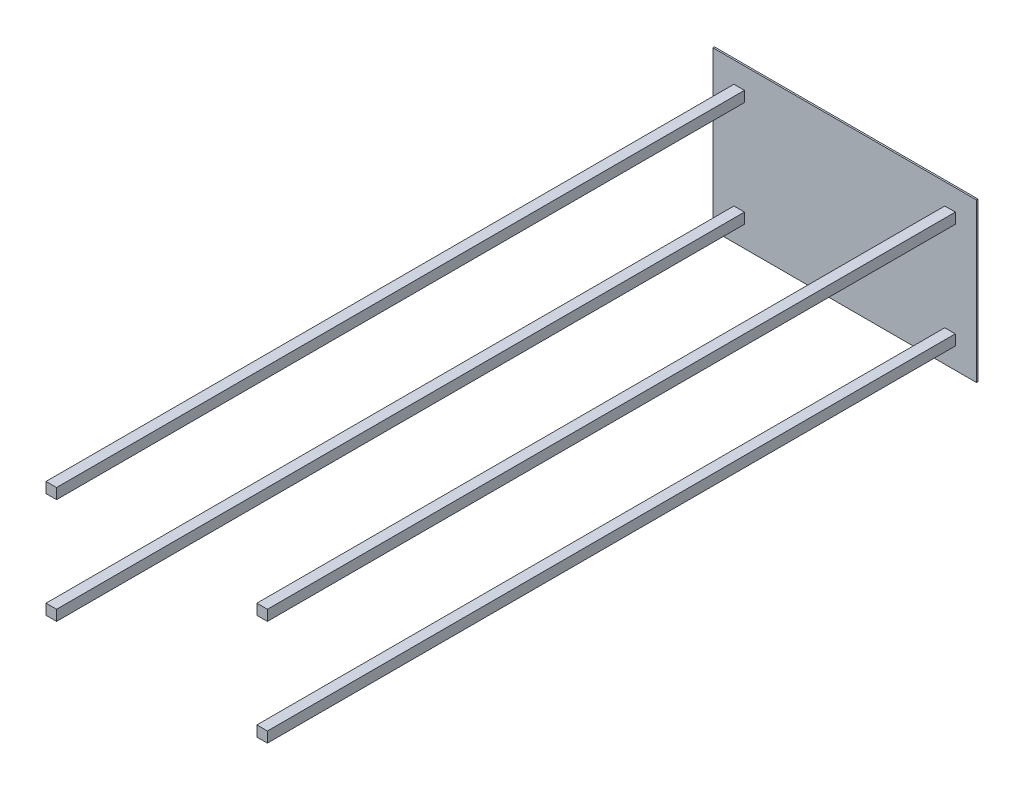
ISO-10303-21;
HEADER;
FILE_DESCRIPTION(('STEP AP214'),'2;1');
FILE_NAME('part.step','',(''),(''),'','','');
FILE_SCHEMA(('AUTOMOTIVE_DESIGN { 1 0 10303 214 1 1 1 1 }'));
ENDSEC;
DATA;
#1=APPLICATION_CONTEXT('core data for automotive mechanical design processes');
#2=APPLICATION_PROTOCOL_DEFINITION('international standard','automotive_design',2000,#1);
#3=PRODUCT_CONTEXT('',#1,'mechanical');
#4=PRODUCT('Part','Part','',(#3));
#5=PRODUCT_RELATED_PRODUCT_CATEGORY('part','',(#4));
#6=PRODUCT_DEFINITION_FORMATION('','',#4);
#7=PRODUCT_DEFINITION_CONTEXT('part definition',#1,'design');
#8=PRODUCT_DEFINITION('design','',#6,#7);
#9=PRODUCT_DEFINITION_SHAPE('','',#8);
#10=(LENGTH_UNIT() NAMED_UNIT(*) SI_UNIT(.MILLI.,.METRE.));
#11=(NAMED_UNIT(*) PLANE_ANGLE_UNIT() SI_UNIT($,.RADIAN.));
#12=(NAMED_UNIT(*) SI_UNIT($,.STERADIAN.) SOLID_ANGLE_UNIT());
#13=UNCERTAINTY_MEASURE_WITH_UNIT(LENGTH_MEASURE(1.E-05),#10,'distance_accuracy_value','');
#14=(GEOMETRIC_REPRESENTATION_CONTEXT(3) GLOBAL_UNCERTAINTY_ASSIGNED_CONTEXT((#13)) GLOBAL_UNIT_ASSIGNED_CONTEXT((#10,
#11,#12)) REPRESENTATION_CONTEXT('',''));
#15=CARTESIAN_POINT('',(0.,0.,0.));
#16=DIRECTION('',(0.,0.,1.));
#17=DIRECTION('',(1.,0.,0.));
#18=AXIS2_PLACEMENT_3D('',#15,#16,#17);
#19=CARTESIAN_POINT('',(0.,0.,3.));
#20=DIRECTION('',(0.,0.,-1.));
#21=DIRECTION('',(-1.,0.,0.));
#22=AXIS2_PLACEMENT_3D('',#19,#20,#21);
#23=PLANE('',#22);
#24=DIRECTION('',(0.,1.,0.));
#25=VECTOR('',#24,1.);
#26=CARTESIAN_POINT('',(-190.,-110.,3.));
#27=LINE('',#26,#25);
#28=CARTESIAN_POINT('',(-190.,-110.,3.));
#29=VERTEX_POINT('',#28);
#30=CARTESIAN_POINT('',(-190.,-90.,3.));
#31=VERTEX_POINT('',#30);
#32=EDGE_CURVE('E205',#29,#31,#27,.T.);
#33=ORIENTED_EDGE('',*,*,#32,.F.);
#34=DIRECTION('',(1.,0.,0.));
#35=VECTOR('',#34,1.);
#36=CARTESIAN_POINT('',(-210.,-110.,3.));
#37=LINE('',#36,#35);
#38=CARTESIAN_POINT('',(-210.,-110.,3.));
#39=VERTEX_POINT('',#38);
#40=EDGE_CURVE('E223',#39,#29,#37,.T.);
#41=ORIENTED_EDGE('',*,*,#40,.F.);
#42=DIRECTION('',(0.,-1.,0.));
#43=VECTOR('',#42,1.);
#44=CARTESIAN_POINT('',(-210.,-110.,3.));
#45=LINE('',#44,#43);
#46=CARTESIAN_POINT('',(-210.,-90.,3.));
#47=VERTEX_POINT('',#46);
#48=EDGE_CURVE('E236',#47,#39,#45,.T.);
#49=ORIENTED_EDGE('',*,*,#48,.F.);
#50=DIRECTION('',(-1.,0.,0.));
#51=VECTOR('',#50,1.);
#52=CARTESIAN_POINT('',(-210.,-90.,3.));
#53=LINE('',#52,#51);
#54=EDGE_CURVE('E211',#31,#47,#53,.T.);
#55=ORIENTED_EDGE('',*,*,#54,.F.);
#56=EDGE_LOOP('',(#33,#41,#49,#55));
#57=FACE_BOUND('',#56,.T.);
#58=DIRECTION('',(0.,1.,0.));
#59=VECTOR('',#58,1.);
#60=CARTESIAN_POINT('',(-190.,90.,3.));
#61=LINE('',#60,#59);
#62=CARTESIAN_POINT('',(-190.,90.,3.));
#63=VERTEX_POINT('',#62);
#64=CARTESIAN_POINT('',(-190.,110.,3.));
#65=VERTEX_POINT('',#64);
#66=EDGE_CURVE('E302',#63,#65,#61,.T.);
#67=ORIENTED_EDGE('',*,*,#66,.F.);
#68=DIRECTION('',(1.,0.,0.));
#69=VECTOR('',#68,1.);
#70=CARTESIAN_POINT('',(-210.,90.,3.));
#71=LINE('',#70,#69);
#72=CARTESIAN_POINT('',(-210.,90.,3.));
#73=VERTEX_POINT('',#72);
#74=EDGE_CURVE('E308',#73,#63,#71,.T.);
#75=ORIENTED_EDGE('',*,*,#74,.F.);
#76=DIRECTION('',(0.,-1.,0.));
#77=VECTOR('',#76,1.);
#78=CARTESIAN_POINT('',(-210.,90.,3.));
#79=LINE('',#78,#77);
#80=CARTESIAN_POINT('',(-210.,110.,3.));
#81=VERTEX_POINT('',#80);
#82=EDGE_CURVE('E325',#81,#73,#79,.T.);
#83=ORIENTED_EDGE('',*,*,#82,.F.);
#84=DIRECTION('',(-1.,0.,0.));
#85=VECTOR('',#84,1.);
#86=CARTESIAN_POINT('',(-210.,110.,3.));
#87=LINE('',#86,#85);
#88=EDGE_CURVE('E321',#65,#81,#87,.T.);
#89=ORIENTED_EDGE('',*,*,#88,.F.);
#90=EDGE_LOOP('',(#67,#75,#83,#89));
#91=FACE_BOUND('',#90,.T.);
#92=DIRECTION('',(0.,1.,0.));
#93=VECTOR('',#92,1.);
#94=CARTESIAN_POINT('',(250.,-150.,3.));
#95=LINE('',#94,#93);
#96=CARTESIAN_POINT('',(250.,-150.,3.));
#97=VERTEX_POINT('',#96);
#98=CARTESIAN_POINT('',(250.,150.,3.));
#99=VERTEX_POINT('',#98);
#100=EDGE_CURVE('E348',#97,#99,#95,.T.);
#101=ORIENTED_EDGE('',*,*,#100,.T.);
#102=DIRECTION('',(-1.,0.,0.));
#103=VECTOR('',#102,1.);
#104=CARTESIAN_POINT('',(-250.,150.,3.));
#105=LINE('',#104,#103);
#106=CARTESIAN_POINT('',(-250.,150.,3.));
#107=VERTEX_POINT('',#106);
#108=EDGE_CURVE('E352',#99,#107,#105,.T.);
#109=ORIENTED_EDGE('',*,*,#108,.T.);
#110=DIRECTION('',(0.,-1.,0.));
#111=VECTOR('',#110,1.);
#112=CARTESIAN_POINT('',(-250.,-150.,3.));
#113=LINE('',#112,#111);
#114=CARTESIAN_POINT('',(-250.,-150.,3.));
#115=VERTEX_POINT('',#114);
#116=EDGE_CURVE('E356',#107,#115,#113,.T.);
#117=ORIENTED_EDGE('',*,*,#116,.T.);
#118=DIRECTION('',(1.,0.,0.));
#119=VECTOR('',#118,1.);
#120=CARTESIAN_POINT('',(-250.,-150.,3.));
#121=LINE('',#120,#119);
#122=EDGE_CURVE('E359',#115,#97,#121,.T.);
#123=ORIENTED_EDGE('',*,*,#122,.T.);
#124=EDGE_LOOP('',(#101,#109,#117,#123));
#125=FACE_BOUND('',#124,.T.);
#126=DIRECTION('',(0.,1.,0.));
#127=VECTOR('',#126,1.);
#128=CARTESIAN_POINT('',(210.,90.,3.));
#129=LINE('',#128,#127);
#130=CARTESIAN_POINT('',(210.,90.,3.));
#131=VERTEX_POINT('',#130);
#132=CARTESIAN_POINT('',(210.,110.,3.));
#133=VERTEX_POINT('',#132);
#134=EDGE_CURVE('E258',#131,#133,#129,.T.);
#135=ORIENTED_EDGE('',*,*,#134,.F.);
#136=DIRECTION('',(1.,0.,0.));
#137=VECTOR('',#136,1.);
#138=CARTESIAN_POINT('',(190.,90.,3.));
#139=LINE('',#138,#137);
#140=CARTESIAN_POINT('',(190.,90.,3.));
#141=VERTEX_POINT('',#140);
#142=EDGE_CURVE('E264',#141,#131,#139,.T.);
#143=ORIENTED_EDGE('',*,*,#142,.F.);
#144=DIRECTION('',(0.,-1.,0.));
#145=VECTOR('',#144,1.);
#146=CARTESIAN_POINT('',(190.,90.,3.));
#147=LINE('',#146,#145);
#148=CARTESIAN_POINT('',(190.,110.,3.));
#149=VERTEX_POINT('',#148);
#150=EDGE_CURVE('E280',#149,#141,#147,.T.);
#151=ORIENTED_EDGE('',*,*,#150,.F.);
#152=DIRECTION('',(-1.,0.,0.));
#153=VECTOR('',#152,1.);
#154=CARTESIAN_POINT('',(190.,110.,3.));
#155=LINE('',#154,#153);
#156=EDGE_CURVE('E276',#133,#149,#155,.T.);
#157=ORIENTED_EDGE('',*,*,#156,.F.);
#158=EDGE_LOOP('',(#135,#143,#151,#157));
#159=FACE_BOUND('',#158,.T.);
#160=DIRECTION('',(0.,1.,0.));
#161=VECTOR('',#160,1.);
#162=CARTESIAN_POINT('',(210.,-110.,3.));
#163=LINE('',#162,#161);
#164=CARTESIAN_POINT('',(210.,-110.,3.));
#165=VERTEX_POINT('',#164);
#166=CARTESIAN_POINT('',(210.,-90.,3.));
#167=VERTEX_POINT('',#166);
#168=EDGE_CURVE('E203',#165,#167,#163,.T.);
#169=ORIENTED_EDGE('',*,*,#168,.F.);
#170=DIRECTION('',(1.,0.,0.));
#171=VECTOR('',#170,1.);
#172=CARTESIAN_POINT('',(190.,-110.,3.));
#173=LINE('',#172,#171);
#174=CARTESIAN_POINT('',(190.,-110.,3.));
#175=VERTEX_POINT('',#174);
#176=EDGE_CURVE('E200',#175,#165,#173,.T.);
#177=ORIENTED_EDGE('',*,*,#176,.F.);
#178=DIRECTION('',(0.,-1.,0.));
#179=VECTOR('',#178,1.);
#180=CARTESIAN_POINT('',(190.,-110.,3.));
#181=LINE('',#180,#179);
#182=CARTESIAN_POINT('',(190.,-90.,3.));
#183=VERTEX_POINT('',#182);
#184=EDGE_CURVE('E64',#183,#175,#181,.T.);
#185=ORIENTED_EDGE('',*,*,#184,.F.);
#186=DIRECTION('',(-1.,0.,0.));
#187=VECTOR('',#186,1.);
#188=CARTESIAN_POINT('',(190.,-90.,3.));
#189=LINE('',#188,#187);
#190=EDGE_CURVE('E59',#167,#183,#189,.T.);
#191=ORIENTED_EDGE('',*,*,#190,.F.);
#192=EDGE_LOOP('',(#169,#177,#185,#191));
#193=FACE_BOUND('',#192,.T.);
#194=ADVANCED_FACE('F43',(#57,#91,#125,#159,#193),#23,.F.);
#195=CARTESIAN_POINT('',(250.,-150.,3.));
#196=DIRECTION('',(-1.,0.,0.));
#197=DIRECTION('',(0.,0.,1.));
#198=AXIS2_PLACEMENT_3D('',#195,#196,#197);
#199=PLANE('',#198);
#200=DIRECTION('',(0.,1.,0.));
#201=VECTOR('',#200,1.);
#202=CARTESIAN_POINT('',(250.,-150.,0.));
#203=LINE('',#202,#201);
#204=CARTESIAN_POINT('',(250.,-150.,0.));
#205=VERTEX_POINT('',#204);
#206=CARTESIAN_POINT('',(250.,150.,0.));
#207=VERTEX_POINT('',#206);
#208=EDGE_CURVE('E347',#205,#207,#203,.T.);
#209=ORIENTED_EDGE('',*,*,#208,.T.);
#210=DIRECTION('',(0.,0.,-1.));
#211=VECTOR('',#210,1.);
#212=CARTESIAN_POINT('',(250.,150.,3.));
#213=LINE('',#212,#211);
#214=EDGE_CURVE('E11',#99,#207,#213,.T.);
#215=ORIENTED_EDGE('',*,*,#214,.F.);
#216=ORIENTED_EDGE('',*,*,#100,.F.);
#217=DIRECTION('',(0.,0.,-1.));
#218=VECTOR('',#217,1.);
#219=CARTESIAN_POINT('',(250.,-150.,3.));
#220=LINE('',#219,#218);
#221=EDGE_CURVE('E362',#97,#205,#220,.T.);
#222=ORIENTED_EDGE('',*,*,#221,.T.);
#223=EDGE_LOOP('',(#209,#215,#216,#222));
#224=FACE_BOUND('',#223,.T.);
#225=ADVANCED_FACE('F45',(#224),#199,.F.);
#226=CARTESIAN_POINT('',(-250.,150.,3.));
#227=DIRECTION('',(0.,-1.,0.));
#228=DIRECTION('',(0.,0.,-1.));
#229=AXIS2_PLACEMENT_3D('',#226,#227,#228);
#230=PLANE('',#229);
#231=DIRECTION('',(-1.,0.,0.));
#232=VECTOR('',#231,1.);
#233=CARTESIAN_POINT('',(-250.,150.,0.));
#234=LINE('',#233,#232);
#235=CARTESIAN_POINT('',(-250.,150.,0.));
#236=VERTEX_POINT('',#235);
#237=EDGE_CURVE('E366',#207,#236,#234,.T.);
#238=ORIENTED_EDGE('',*,*,#237,.T.);
#239=DIRECTION('',(0.,0.,-1.));
#240=VECTOR('',#239,1.);
#241=CARTESIAN_POINT('',(-250.,150.,3.));
#242=LINE('',#241,#240);
#243=EDGE_CURVE('E52',#107,#236,#242,.T.);
#244=ORIENTED_EDGE('',*,*,#243,.F.);
#245=ORIENTED_EDGE('',*,*,#108,.F.);
#246=ORIENTED_EDGE('',*,*,#214,.T.);
#247=EDGE_LOOP('',(#238,#244,#245,#246));
#248=FACE_BOUND('',#247,.T.);
#249=ADVANCED_FACE('F402',(#248),#230,.F.);
#250=CARTESIAN_POINT('',(-250.,-150.,3.));
#251=DIRECTION('',(1.,0.,0.));
#252=DIRECTION('',(0.,0.,-1.));
#253=AXIS2_PLACEMENT_3D('',#250,#251,#252);
#254=PLANE('',#253);
#255=DIRECTION('',(0.,-1.,0.));
#256=VECTOR('',#255,1.);
#257=CARTESIAN_POINT('',(-250.,-150.,0.));
#258=LINE('',#257,#256);
#259=CARTESIAN_POINT('',(-250.,-150.,0.));
#260=VERTEX_POINT('',#259);
#261=EDGE_CURVE('E369',#236,#260,#258,.T.);
#262=ORIENTED_EDGE('',*,*,#261,.T.);
#263=DIRECTION('',(0.,0.,-1.));
#264=VECTOR('',#263,1.);
#265=CARTESIAN_POINT('',(-250.,-150.,3.));
#266=LINE('',#265,#264);
#267=EDGE_CURVE('E377',#115,#260,#266,.T.);
#268=ORIENTED_EDGE('',*,*,#267,.F.);
#269=ORIENTED_EDGE('',*,*,#116,.F.);
#270=ORIENTED_EDGE('',*,*,#243,.T.);
#271=EDGE_LOOP('',(#262,#268,#269,#270));
#272=FACE_BOUND('',#271,.T.);
#273=ADVANCED_FACE('F386',(#272),#254,.F.);
#274=CARTESIAN_POINT('',(-250.,-150.,3.));
#275=DIRECTION('',(0.,1.,0.));
#276=DIRECTION('',(0.,0.,1.));
#277=AXIS2_PLACEMENT_3D('',#274,#275,#276);
#278=PLANE('',#277);
#279=DIRECTION('',(1.,0.,0.));
#280=VECTOR('',#279,1.);
#281=CARTESIAN_POINT('',(-250.,-150.,0.));
#282=LINE('',#281,#280);
#283=EDGE_CURVE('E353',#260,#205,#282,.T.);
#284=ORIENTED_EDGE('',*,*,#283,.T.);
#285=ORIENTED_EDGE('',*,*,#221,.F.);
#286=ORIENTED_EDGE('',*,*,#122,.F.);
#287=ORIENTED_EDGE('',*,*,#267,.T.);
#288=EDGE_LOOP('',(#284,#285,#286,#287));
#289=FACE_BOUND('',#288,.T.);
#290=ADVANCED_FACE('F395',(#289),#278,.F.);
#291=CARTESIAN_POINT('',(0.,0.,0.));
#292=DIRECTION('',(0.,0.,-1.));
#293=DIRECTION('',(-1.,0.,0.));
#294=AXIS2_PLACEMENT_3D('',#291,#292,#293);
#295=PLANE('',#294);
#296=ORIENTED_EDGE('',*,*,#208,.F.);
#297=ORIENTED_EDGE('',*,*,#283,.F.);
#298=ORIENTED_EDGE('',*,*,#261,.F.);
#299=ORIENTED_EDGE('',*,*,#237,.F.);
#300=EDGE_LOOP('',(#296,#297,#298,#299));
#301=FACE_BOUND('',#300,.T.);
#302=ADVANCED_FACE('F392',(#301),#295,.T.);
#303=CARTESIAN_POINT('',(-190.,90.,1308.));
#304=DIRECTION('',(-1.,0.,0.));
#305=DIRECTION('',(0.,0.,1.));
#306=AXIS2_PLACEMENT_3D('',#303,#304,#305);
#307=PLANE('',#306);
#308=ORIENTED_EDGE('',*,*,#66,.T.);
#309=DIRECTION('',(0.,0.,-1.));
#310=VECTOR('',#309,1.);
#311=CARTESIAN_POINT('',(-190.,110.,1308.));
#312=LINE('',#311,#310);
#313=CARTESIAN_POINT('',(-190.,110.,1308.));
#314=VERTEX_POINT('',#313);
#315=EDGE_CURVE('E343',#314,#65,#312,.T.);
#316=ORIENTED_EDGE('',*,*,#315,.F.);
#317=DIRECTION('',(0.,1.,0.));
#318=VECTOR('',#317,1.);
#319=CARTESIAN_POINT('',(-190.,90.,1308.));
#320=LINE('',#319,#318);
#321=CARTESIAN_POINT('',(-190.,90.,1308.));
#322=VERTEX_POINT('',#321);
#323=EDGE_CURVE('E303',#322,#314,#320,.T.);
#324=ORIENTED_EDGE('',*,*,#323,.F.);
#325=DIRECTION('',(0.,0.,-1.));
#326=VECTOR('',#325,1.);
#327=CARTESIAN_POINT('',(-190.,90.,1308.));
#328=LINE('',#327,#326);
#329=EDGE_CURVE('E317',#322,#63,#328,.T.);
#330=ORIENTED_EDGE('',*,*,#329,.T.);
#331=EDGE_LOOP('',(#308,#316,#324,#330));
#332=FACE_BOUND('',#331,.T.);
#333=ADVANCED_FACE('F417',(#332),#307,.F.);
#334=CARTESIAN_POINT('',(-210.,110.,1308.));
#335=DIRECTION('',(0.,-1.,0.));
#336=DIRECTION('',(0.,0.,-1.));
#337=AXIS2_PLACEMENT_3D('',#334,#335,#336);
#338=PLANE('',#337);
#339=ORIENTED_EDGE('',*,*,#88,.T.);
#340=DIRECTION('',(0.,0.,-1.));
#341=VECTOR('',#340,1.);
#342=CARTESIAN_POINT('',(-210.,110.,1308.));
#343=LINE('',#342,#341);
#344=CARTESIAN_POINT('',(-210.,110.,1308.));
#345=VERTEX_POINT('',#344);
#346=EDGE_CURVE('E339',#345,#81,#343,.T.);
#347=ORIENTED_EDGE('',*,*,#346,.F.);
#348=DIRECTION('',(-1.,0.,0.));
#349=VECTOR('',#348,1.);
#350=CARTESIAN_POINT('',(-210.,110.,1308.));
#351=LINE('',#350,#349);
#352=EDGE_CURVE('E307',#314,#345,#351,.T.);
#353=ORIENTED_EDGE('',*,*,#352,.F.);
#354=ORIENTED_EDGE('',*,*,#315,.T.);
#355=EDGE_LOOP('',(#339,#347,#353,#354));
#356=FACE_BOUND('',#355,.T.);
#357=ADVANCED_FACE('F434',(#356),#338,.F.);
#358=CARTESIAN_POINT('',(-210.,90.,1308.));
#359=DIRECTION('',(1.,0.,0.));
#360=DIRECTION('',(0.,0.,-1.));
#361=AXIS2_PLACEMENT_3D('',#358,#359,#360);
#362=PLANE('',#361);
#363=ORIENTED_EDGE('',*,*,#82,.T.);
#364=DIRECTION('',(0.,0.,-1.));
#365=VECTOR('',#364,1.);
#366=CARTESIAN_POINT('',(-210.,90.,1308.));
#367=LINE('',#366,#365);
#368=CARTESIAN_POINT('',(-210.,90.,1308.));
#369=VERTEX_POINT('',#368);
#370=EDGE_CURVE('E335',#369,#73,#367,.T.);
#371=ORIENTED_EDGE('',*,*,#370,.F.);
#372=DIRECTION('',(0.,-1.,0.));
#373=VECTOR('',#372,1.);
#374=CARTESIAN_POINT('',(-210.,90.,1308.));
#375=LINE('',#374,#373);
#376=EDGE_CURVE('E311',#345,#369,#375,.T.);
#377=ORIENTED_EDGE('',*,*,#376,.F.);
#378=ORIENTED_EDGE('',*,*,#346,.T.);
#379=EDGE_LOOP('',(#363,#371,#377,#378));
#380=FACE_BOUND('',#379,.T.);
#381=ADVANCED_FACE('F440',(#380),#362,.F.);
#382=CARTESIAN_POINT('',(-210.,90.,1308.));
#383=DIRECTION('',(0.,1.,0.));
#384=DIRECTION('',(0.,0.,1.));
#385=AXIS2_PLACEMENT_3D('',#382,#383,#384);
#386=PLANE('',#385);
#387=ORIENTED_EDGE('',*,*,#74,.T.);
#388=ORIENTED_EDGE('',*,*,#329,.F.);
#389=DIRECTION('',(1.,0.,0.));
#390=VECTOR('',#389,1.);
#391=CARTESIAN_POINT('',(-210.,90.,1308.));
#392=LINE('',#391,#390);
#393=EDGE_CURVE('E314',#369,#322,#392,.T.);
#394=ORIENTED_EDGE('',*,*,#393,.F.);
#395=ORIENTED_EDGE('',*,*,#370,.T.);
#396=EDGE_LOOP('',(#387,#388,#394,#395));
#397=FACE_BOUND('',#396,.T.);
#398=ADVANCED_FACE('F446',(#397),#386,.F.);
#399=CARTESIAN_POINT('',(0.,0.,1308.));
#400=DIRECTION('',(0.,0.,-1.));
#401=DIRECTION('',(-1.,0.,0.));
#402=AXIS2_PLACEMENT_3D('',#399,#400,#401);
#403=PLANE('',#402);
#404=ORIENTED_EDGE('',*,*,#323,.T.);
#405=ORIENTED_EDGE('',*,*,#352,.T.);
#406=ORIENTED_EDGE('',*,*,#376,.T.);
#407=ORIENTED_EDGE('',*,*,#393,.T.);
#408=EDGE_LOOP('',(#404,#405,#406,#407));
#409=FACE_BOUND('',#408,.T.);
#410=ADVANCED_FACE('F453',(#409),#403,.F.);
#411=CARTESIAN_POINT('',(210.,90.,1308.));
#412=DIRECTION('',(-1.,0.,0.));
#413=DIRECTION('',(0.,0.,1.));
#414=AXIS2_PLACEMENT_3D('',#411,#412,#413);
#415=PLANE('',#414);
#416=ORIENTED_EDGE('',*,*,#134,.T.);
#417=DIRECTION('',(0.,0.,-1.));
#418=VECTOR('',#417,1.);
#419=CARTESIAN_POINT('',(210.,110.,1308.));
#420=LINE('',#419,#418);
#421=CARTESIAN_POINT('',(210.,110.,1308.));
#422=VERTEX_POINT('',#421);
#423=EDGE_CURVE('E298',#422,#133,#420,.T.);
#424=ORIENTED_EDGE('',*,*,#423,.F.);
#425=DIRECTION('',(0.,1.,0.));
#426=VECTOR('',#425,1.);
#427=CARTESIAN_POINT('',(210.,90.,1308.));
#428=LINE('',#427,#426);
#429=CARTESIAN_POINT('',(210.,90.,1308.));
#430=VERTEX_POINT('',#429);
#431=EDGE_CURVE('E259',#430,#422,#428,.T.);
#432=ORIENTED_EDGE('',*,*,#431,.F.);
#433=DIRECTION('',(0.,0.,-1.));
#434=VECTOR('',#433,1.);
#435=CARTESIAN_POINT('',(210.,90.,1308.));
#436=LINE('',#435,#434);
#437=EDGE_CURVE('E272',#430,#131,#436,.T.);
#438=ORIENTED_EDGE('',*,*,#437,.T.);
#439=EDGE_LOOP('',(#416,#424,#432,#438));
#440=FACE_BOUND('',#439,.T.);
#441=ADVANCED_FACE('F460',(#440),#415,.F.);
#442=CARTESIAN_POINT('',(190.,110.,1308.));
#443=DIRECTION('',(0.,-1.,0.));
#444=DIRECTION('',(0.,0.,-1.));
#445=AXIS2_PLACEMENT_3D('',#442,#443,#444);
#446=PLANE('',#445);
#447=ORIENTED_EDGE('',*,*,#156,.T.);
#448=DIRECTION('',(0.,0.,-1.));
#449=VECTOR('',#448,1.);
#450=CARTESIAN_POINT('',(190.,110.,1308.));
#451=LINE('',#450,#449);
#452=CARTESIAN_POINT('',(190.,110.,1308.));
#453=VERTEX_POINT('',#452);
#454=EDGE_CURVE('E294',#453,#149,#451,.T.);
#455=ORIENTED_EDGE('',*,*,#454,.F.);
#456=DIRECTION('',(-1.,0.,0.));
#457=VECTOR('',#456,1.);
#458=CARTESIAN_POINT('',(190.,110.,1308.));
#459=LINE('',#458,#457);
#460=EDGE_CURVE('E263',#422,#453,#459,.T.);
#461=ORIENTED_EDGE('',*,*,#460,.F.);
#462=ORIENTED_EDGE('',*,*,#423,.T.);
#463=EDGE_LOOP('',(#447,#455,#461,#462));
#464=FACE_BOUND('',#463,.T.);
#465=ADVANCED_FACE('F467',(#464),#446,.F.);
#466=CARTESIAN_POINT('',(190.,90.,1308.));
#467=DIRECTION('',(1.,0.,0.));
#468=DIRECTION('',(0.,0.,-1.));
#469=AXIS2_PLACEMENT_3D('',#466,#467,#468);
#470=PLANE('',#469);
#471=ORIENTED_EDGE('',*,*,#150,.T.);
#472=DIRECTION('',(0.,0.,-1.));
#473=VECTOR('',#472,1.);
#474=CARTESIAN_POINT('',(190.,90.,1308.));
#475=LINE('',#474,#473);
#476=CARTESIAN_POINT('',(190.,90.,1308.));
#477=VERTEX_POINT('',#476);
#478=EDGE_CURVE('E290',#477,#141,#475,.T.);
#479=ORIENTED_EDGE('',*,*,#478,.F.);
#480=DIRECTION('',(0.,-1.,0.));
#481=VECTOR('',#480,1.);
#482=CARTESIAN_POINT('',(190.,90.,1308.));
#483=LINE('',#482,#481);
#484=EDGE_CURVE('E266',#453,#477,#483,.T.);
#485=ORIENTED_EDGE('',*,*,#484,.F.);
#486=ORIENTED_EDGE('',*,*,#454,.T.);
#487=EDGE_LOOP('',(#471,#479,#485,#486));
#488=FACE_BOUND('',#487,.T.);
#489=ADVANCED_FACE('F474',(#488),#470,.F.);
#490=CARTESIAN_POINT('',(190.,90.,1308.));
#491=DIRECTION('',(0.,1.,0.));
#492=DIRECTION('',(0.,0.,1.));
#493=AXIS2_PLACEMENT_3D('',#490,#491,#492);
#494=PLANE('',#493);
#495=ORIENTED_EDGE('',*,*,#142,.T.);
#496=ORIENTED_EDGE('',*,*,#437,.F.);
#497=DIRECTION('',(1.,0.,0.));
#498=VECTOR('',#497,1.);
#499=CARTESIAN_POINT('',(190.,90.,1308.));
#500=LINE('',#499,#498);
#501=EDGE_CURVE('E269',#477,#430,#500,.T.);
#502=ORIENTED_EDGE('',*,*,#501,.F.);
#503=ORIENTED_EDGE('',*,*,#478,.T.);
#504=EDGE_LOOP('',(#495,#496,#502,#503));
#505=FACE_BOUND('',#504,.T.);
#506=ADVANCED_FACE('F481',(#505),#494,.F.);
#507=CARTESIAN_POINT('',(400.,0.,1308.));
#508=DIRECTION('',(0.,0.,-1.));
#509=DIRECTION('',(-1.,0.,0.));
#510=AXIS2_PLACEMENT_3D('',#507,#508,#509);
#511=PLANE('',#510);
#512=ORIENTED_EDGE('',*,*,#431,.T.);
#513=ORIENTED_EDGE('',*,*,#460,.T.);
#514=ORIENTED_EDGE('',*,*,#484,.T.);
#515=ORIENTED_EDGE('',*,*,#501,.T.);
#516=EDGE_LOOP('',(#512,#513,#514,#515));
#517=FACE_BOUND('',#516,.T.);
#518=ADVANCED_FACE('F488',(#517),#511,.F.);
#519=CARTESIAN_POINT('',(-190.,-110.,1308.));
#520=DIRECTION('',(-1.,0.,0.));
#521=DIRECTION('',(0.,0.,1.));
#522=AXIS2_PLACEMENT_3D('',#519,#520,#521);
#523=PLANE('',#522);
#524=ORIENTED_EDGE('',*,*,#32,.T.);
#525=DIRECTION('',(0.,0.,-1.));
#526=VECTOR('',#525,1.);
#527=CARTESIAN_POINT('',(-190.,-90.,1308.));
#528=LINE('',#527,#526);
#529=CARTESIAN_POINT('',(-190.,-90.,1308.));
#530=VERTEX_POINT('',#529);
#531=EDGE_CURVE('E254',#530,#31,#528,.T.);
#532=ORIENTED_EDGE('',*,*,#531,.F.);
#533=DIRECTION('',(0.,1.,0.));
#534=VECTOR('',#533,1.);
#535=CARTESIAN_POINT('',(-190.,-110.,1308.));
#536=LINE('',#535,#534);
#537=CARTESIAN_POINT('',(-190.,-110.,1308.));
#538=VERTEX_POINT('',#537);
#539=EDGE_CURVE('E218',#538,#530,#536,.T.);
#540=ORIENTED_EDGE('',*,*,#539,.F.);
#541=DIRECTION('',(0.,0.,-1.));
#542=VECTOR('',#541,1.);
#543=CARTESIAN_POINT('',(-190.,-110.,1308.));
#544=LINE('',#543,#542);
#545=EDGE_CURVE('E231',#538,#29,#544,.T.);
#546=ORIENTED_EDGE('',*,*,#545,.T.);
#547=EDGE_LOOP('',(#524,#532,#540,#546));
#548=FACE_BOUND('',#547,.T.);
#549=ADVANCED_FACE('F495',(#548),#523,.F.);
#550=CARTESIAN_POINT('',(-210.,-90.,1308.));
#551=DIRECTION('',(0.,-1.,0.));
#552=DIRECTION('',(0.,0.,-1.));
#553=AXIS2_PLACEMENT_3D('',#550,#551,#552);
#554=PLANE('',#553);
#555=ORIENTED_EDGE('',*,*,#54,.T.);
#556=DIRECTION('',(0.,0.,-1.));
#557=VECTOR('',#556,1.);
#558=CARTESIAN_POINT('',(-210.,-90.,1308.));
#559=LINE('',#558,#557);
#560=CARTESIAN_POINT('',(-210.,-90.,1308.));
#561=VERTEX_POINT('',#560);
#562=EDGE_CURVE('E250',#561,#47,#559,.T.);
#563=ORIENTED_EDGE('',*,*,#562,.F.);
#564=DIRECTION('',(-1.,0.,0.));
#565=VECTOR('',#564,1.);
#566=CARTESIAN_POINT('',(-210.,-90.,1308.));
#567=LINE('',#566,#565);
#568=EDGE_CURVE('E222',#530,#561,#567,.T.);
#569=ORIENTED_EDGE('',*,*,#568,.F.);
#570=ORIENTED_EDGE('',*,*,#531,.T.);
#571=EDGE_LOOP('',(#555,#563,#569,#570));
#572=FACE_BOUND('',#571,.T.);
#573=ADVANCED_FACE('F502',(#572),#554,.F.);
#574=CARTESIAN_POINT('',(-210.,-110.,1308.));
#575=DIRECTION('',(1.,0.,0.));
#576=DIRECTION('',(0.,0.,-1.));
#577=AXIS2_PLACEMENT_3D('',#574,#575,#576);
#578=PLANE('',#577);
#579=ORIENTED_EDGE('',*,*,#48,.T.);
#580=DIRECTION('',(0.,0.,-1.));
#581=VECTOR('',#580,1.);
#582=CARTESIAN_POINT('',(-210.,-110.,1308.));
#583=LINE('',#582,#581);
#584=CARTESIAN_POINT('',(-210.,-110.,1308.));
#585=VERTEX_POINT('',#584);
#586=EDGE_CURVE('E246',#585,#39,#583,.T.);
#587=ORIENTED_EDGE('',*,*,#586,.F.);
#588=DIRECTION('',(0.,-1.,0.));
#589=VECTOR('',#588,1.);
#590=CARTESIAN_POINT('',(-210.,-110.,1308.));
#591=LINE('',#590,#589);
#592=EDGE_CURVE('E226',#561,#585,#591,.T.);
#593=ORIENTED_EDGE('',*,*,#592,.F.);
#594=ORIENTED_EDGE('',*,*,#562,.T.);
#595=EDGE_LOOP('',(#579,#587,#593,#594));
#596=FACE_BOUND('',#595,.T.);
#597=ADVANCED_FACE('F509',(#596),#578,.F.);
#598=CARTESIAN_POINT('',(-210.,-110.,1308.));
#599=DIRECTION('',(0.,1.,0.));
#600=DIRECTION('',(0.,0.,1.));
#601=AXIS2_PLACEMENT_3D('',#598,#599,#600);
#602=PLANE('',#601);
#603=ORIENTED_EDGE('',*,*,#40,.T.);
#604=ORIENTED_EDGE('',*,*,#545,.F.);
#605=DIRECTION('',(1.,0.,0.));
#606=VECTOR('',#605,1.);
#607=CARTESIAN_POINT('',(-210.,-110.,1308.));
#608=LINE('',#607,#606);
#609=EDGE_CURVE('E229',#585,#538,#608,.T.);
#610=ORIENTED_EDGE('',*,*,#609,.F.);
#611=ORIENTED_EDGE('',*,*,#586,.T.);
#612=EDGE_LOOP('',(#603,#604,#610,#611));
#613=FACE_BOUND('',#612,.T.);
#614=ADVANCED_FACE('F516',(#613),#602,.F.);
#615=CARTESIAN_POINT('',(0.,-200.,1308.));
#616=DIRECTION('',(0.,0.,-1.));
#617=DIRECTION('',(-1.,0.,0.));
#618=AXIS2_PLACEMENT_3D('',#615,#616,#617);
#619=PLANE('',#618);
#620=ORIENTED_EDGE('',*,*,#539,.T.);
#621=ORIENTED_EDGE('',*,*,#568,.T.);
#622=ORIENTED_EDGE('',*,*,#592,.T.);
#623=ORIENTED_EDGE('',*,*,#609,.T.);
#624=EDGE_LOOP('',(#620,#621,#622,#623));
#625=FACE_BOUND('',#624,.T.);
#626=ADVANCED_FACE('F523',(#625),#619,.F.);
#627=CARTESIAN_POINT('',(210.,-110.,1308.));
#628=DIRECTION('',(-1.,0.,0.));
#629=DIRECTION('',(0.,0.,1.));
#630=AXIS2_PLACEMENT_3D('',#627,#628,#629);
#631=PLANE('',#630);
#632=ORIENTED_EDGE('',*,*,#168,.T.);
#633=DIRECTION('',(0.,0.,-1.));
#634=VECTOR('',#633,1.);
#635=CARTESIAN_POINT('',(210.,-90.,1308.));
#636=LINE('',#635,#634);
#637=CARTESIAN_POINT('',(210.,-90.,1308.));
#638=VERTEX_POINT('',#637);
#639=EDGE_CURVE('E182',#638,#167,#636,.T.);
#640=ORIENTED_EDGE('',*,*,#639,.F.);
#641=DIRECTION('',(0.,1.,0.));
#642=VECTOR('',#641,1.);
#643=CARTESIAN_POINT('',(210.,-110.,1308.));
#644=LINE('',#643,#642);
#645=CARTESIAN_POINT('',(210.,-110.,1308.));
#646=VERTEX_POINT('',#645);
#647=EDGE_CURVE('E190',#646,#638,#644,.T.);
#648=ORIENTED_EDGE('',*,*,#647,.F.);
#649=DIRECTION('',(0.,0.,-1.));
#650=VECTOR('',#649,1.);
#651=CARTESIAN_POINT('',(210.,-110.,1308.));
#652=LINE('',#651,#650);
#653=EDGE_CURVE('E703',#646,#165,#652,.T.);
#654=ORIENTED_EDGE('',*,*,#653,.T.);
#655=EDGE_LOOP('',(#632,#640,#648,#654));
#656=FACE_BOUND('',#655,.T.);
#657=ADVANCED_FACE('F202',(#656),#631,.F.);
#658=CARTESIAN_POINT('',(190.,-90.,1308.));
#659=DIRECTION('',(0.,-1.,0.));
#660=DIRECTION('',(0.,0.,-1.));
#661=AXIS2_PLACEMENT_3D('',#658,#659,#660);
#662=PLANE('',#661);
#663=ORIENTED_EDGE('',*,*,#190,.T.);
#664=DIRECTION('',(0.,0.,-1.));
#665=VECTOR('',#664,1.);
#666=CARTESIAN_POINT('',(190.,-90.,1308.));
#667=LINE('',#666,#665);
#668=CARTESIAN_POINT('',(190.,-90.,1308.));
#669=VERTEX_POINT('',#668);
#670=EDGE_CURVE('E185',#669,#183,#667,.T.);
#671=ORIENTED_EDGE('',*,*,#670,.F.);
#672=DIRECTION('',(-1.,0.,0.));
#673=VECTOR('',#672,1.);
#674=CARTESIAN_POINT('',(190.,-90.,1308.));
#675=LINE('',#674,#673);
#676=EDGE_CURVE('E178',#638,#669,#675,.T.);
#677=ORIENTED_EDGE('',*,*,#676,.F.);
#678=ORIENTED_EDGE('',*,*,#639,.T.);
#679=EDGE_LOOP('',(#663,#671,#677,#678));
#680=FACE_BOUND('',#679,.T.);
#681=ADVANCED_FACE('F180',(#680),#662,.F.);
#682=CARTESIAN_POINT('',(190.,-110.,1308.));
#683=DIRECTION('',(1.,0.,0.));
#684=DIRECTION('',(0.,0.,-1.));
#685=AXIS2_PLACEMENT_3D('',#682,#683,#684);
#686=PLANE('',#685);
#687=ORIENTED_EDGE('',*,*,#184,.T.);
#688=DIRECTION('',(0.,0.,-1.));
#689=VECTOR('',#688,1.);
#690=CARTESIAN_POINT('',(190.,-110.,1308.));
#691=LINE('',#690,#689);
#692=CARTESIAN_POINT('',(190.,-110.,1308.));
#693=VERTEX_POINT('',#692);
#694=EDGE_CURVE('E214',#693,#175,#691,.T.);
#695=ORIENTED_EDGE('',*,*,#694,.F.);
#696=DIRECTION('',(0.,-1.,0.));
#697=VECTOR('',#696,1.);
#698=CARTESIAN_POINT('',(190.,-110.,1308.));
#699=LINE('',#698,#697);
#700=EDGE_CURVE('E189',#669,#693,#699,.T.);
#701=ORIENTED_EDGE('',*,*,#700,.F.);
#702=ORIENTED_EDGE('',*,*,#670,.T.);
#703=EDGE_LOOP('',(#687,#695,#701,#702));
#704=FACE_BOUND('',#703,.T.);
#705=ADVANCED_FACE('F541',(#704),#686,.F.);
#706=CARTESIAN_POINT('',(190.,-110.,1308.));
#707=DIRECTION('',(0.,1.,0.));
#708=DIRECTION('',(0.,0.,1.));
#709=AXIS2_PLACEMENT_3D('',#706,#707,#708);
#710=PLANE('',#709);
#711=ORIENTED_EDGE('',*,*,#176,.T.);
#712=ORIENTED_EDGE('',*,*,#653,.F.);
#713=DIRECTION('',(1.,0.,0.));
#714=VECTOR('',#713,1.);
#715=CARTESIAN_POINT('',(190.,-110.,1308.));
#716=LINE('',#715,#714);
#717=EDGE_CURVE('E195',#693,#646,#716,.T.);
#718=ORIENTED_EDGE('',*,*,#717,.F.);
#719=ORIENTED_EDGE('',*,*,#694,.T.);
#720=EDGE_LOOP('',(#711,#712,#718,#719));
#721=FACE_BOUND('',#720,.T.);
#722=ADVANCED_FACE('F547',(#721),#710,.F.);
#723=CARTESIAN_POINT('',(400.,-200.,1308.));
#724=DIRECTION('',(0.,0.,-1.));
#725=DIRECTION('',(-1.,0.,0.));
#726=AXIS2_PLACEMENT_3D('',#723,#724,#725);
#727=PLANE('',#726);
#728=ORIENTED_EDGE('',*,*,#647,.T.);
#729=ORIENTED_EDGE('',*,*,#676,.T.);
#730=ORIENTED_EDGE('',*,*,#700,.T.);
#731=ORIENTED_EDGE('',*,*,#717,.T.);
#732=EDGE_LOOP('',(#728,#729,#730,#731));
#733=FACE_BOUND('',#732,.T.);
#734=ADVANCED_FACE('F193',(#733),#727,.F.);
#735=CLOSED_SHELL('',(#194,#225,#249,#273,#290,#302,#333,#357,#381,#398,#410,#441,#465,#489,
#506,#518,#549,#573,#597,#614,#626,#657,#681,#705,#722,#734));
#736=MANIFOLD_SOLID_BREP('B2',#735);
#737=ADVANCED_BREP_SHAPE_REPRESENTATION('',(#18,#736),#14);
#738=SHAPE_DEFINITION_REPRESENTATION(#9,#737);
ENDSEC;
END-ISO-10303-21;
